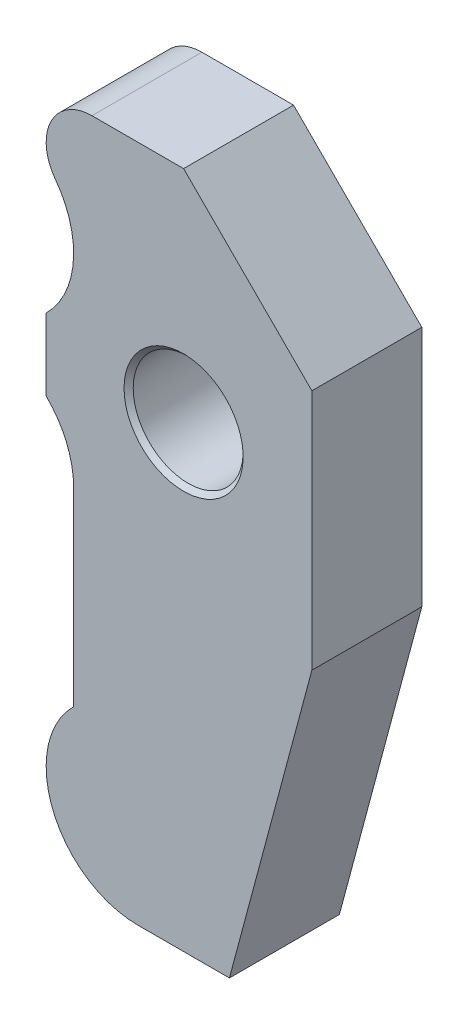
ISO-10303-21;
HEADER;
FILE_DESCRIPTION(('STEP AP214'),'2;1');
FILE_NAME('part.step','',(''),(''),'','','');
FILE_SCHEMA(('AUTOMOTIVE_DESIGN { 1 0 10303 214 1 1 1 1 }'));
ENDSEC;
DATA;
#1=APPLICATION_CONTEXT('core data for automotive mechanical design processes');
#2=APPLICATION_PROTOCOL_DEFINITION('international standard','automotive_design',2000,#1);
#3=PRODUCT_CONTEXT('',#1,'mechanical');
#4=PRODUCT('Part','Part','',(#3));
#5=PRODUCT_RELATED_PRODUCT_CATEGORY('part','',(#4));
#6=PRODUCT_DEFINITION_FORMATION('','',#4);
#7=PRODUCT_DEFINITION_CONTEXT('part definition',#1,'design');
#8=PRODUCT_DEFINITION('design','',#6,#7);
#9=PRODUCT_DEFINITION_SHAPE('','',#8);
#10=(LENGTH_UNIT() NAMED_UNIT(*) SI_UNIT(.MILLI.,.METRE.));
#11=(NAMED_UNIT(*) PLANE_ANGLE_UNIT() SI_UNIT($,.RADIAN.));
#12=(NAMED_UNIT(*) SI_UNIT($,.STERADIAN.) SOLID_ANGLE_UNIT());
#13=UNCERTAINTY_MEASURE_WITH_UNIT(LENGTH_MEASURE(1.E-05),#10,'distance_accuracy_value','');
#14=(GEOMETRIC_REPRESENTATION_CONTEXT(3) GLOBAL_UNCERTAINTY_ASSIGNED_CONTEXT((#13)) GLOBAL_UNIT_ASSIGNED_CONTEXT((#10,
#11,#12)) REPRESENTATION_CONTEXT('',''));
#15=CARTESIAN_POINT('',(0.,0.,0.));
#16=DIRECTION('',(0.,0.,1.));
#17=DIRECTION('',(1.,0.,0.));
#18=AXIS2_PLACEMENT_3D('',#15,#16,#17);
#19=CARTESIAN_POINT('',(-10.,19.,6.));
#20=DIRECTION('',(0.,0.,-1.));
#21=DIRECTION('',(-1.,0.,0.));
#22=AXIS2_PLACEMENT_3D('',#19,#20,#21);
#23=PLANE('',#22);
#24=CARTESIAN_POINT('',(0.,0.,6.));
#25=DIRECTION('',(0.,0.,-1.));
#26=DIRECTION('',(-1.,0.,0.));
#27=AXIS2_PLACEMENT_3D('',#24,#25,#26);
#28=CIRCLE('',#27,6.50000000000001);
#29=CARTESIAN_POINT('',(-6.50000000000001,0.,6.));
#30=VERTEX_POINT('',#29);
#31=EDGE_CURVE('E11',#30,#30,#28,.T.);
#32=ORIENTED_EDGE('',*,*,#31,.T.);
#33=EDGE_LOOP('',(#32));
#34=FACE_BOUND('',#33,.T.);
#35=DIRECTION('',(-1.,0.,0.));
#36=VECTOR('',#35,1.);
#37=CARTESIAN_POINT('',(0.,24.,6.));
#38=LINE('',#37,#36);
#39=CARTESIAN_POINT('',(0.,24.,6.));
#40=VERTEX_POINT('',#39);
#41=CARTESIAN_POINT('',(-10.,24.,6.));
#42=VERTEX_POINT('',#41);
#43=EDGE_CURVE('E171',#40,#42,#38,.T.);
#44=ORIENTED_EDGE('',*,*,#43,.T.);
#45=CARTESIAN_POINT('',(-10.,19.,6.));
#46=DIRECTION('',(0.,0.,1.));
#47=DIRECTION('',(-1.,0.,0.));
#48=AXIS2_PLACEMENT_3D('',#45,#46,#47);
#49=CIRCLE('',#48,5.);
#50=CARTESIAN_POINT('',(-14.,16.,6.));
#51=VERTEX_POINT('',#50);
#52=EDGE_CURVE('E106',#42,#51,#49,.T.);
#53=ORIENTED_EDGE('',*,*,#52,.T.);
#54=CARTESIAN_POINT('',(-22.,10.,6.));
#55=DIRECTION('',(0.,0.,-1.));
#56=DIRECTION('',(1.,0.,0.));
#57=AXIS2_PLACEMENT_3D('',#54,#55,#56);
#58=CIRCLE('',#57,10.);
#59=CARTESIAN_POINT('',(-15.,2.85857157145716,6.));
#60=VERTEX_POINT('',#59);
#61=EDGE_CURVE('E361',#51,#60,#58,.T.);
#62=ORIENTED_EDGE('',*,*,#61,.T.);
#63=DIRECTION('',(0.,-1.,0.));
#64=VECTOR('',#63,1.);
#65=CARTESIAN_POINT('',(-15.,-5.,6.));
#66=LINE('',#65,#64);
#67=CARTESIAN_POINT('',(-15.,-5.,6.));
#68=VERTEX_POINT('',#67);
#69=EDGE_CURVE('E372',#60,#68,#66,.T.);
#70=ORIENTED_EDGE('',*,*,#69,.T.);
#71=CARTESIAN_POINT('',(-22.,-12.1414284285429,6.));
#72=DIRECTION('',(0.,0.,-1.));
#73=DIRECTION('',(1.,0.,0.));
#74=AXIS2_PLACEMENT_3D('',#71,#72,#73);
#75=CIRCLE('',#74,10.);
#76=CARTESIAN_POINT('',(-12.,-12.1414284285429,6.));
#77=VERTEX_POINT('',#76);
#78=EDGE_CURVE('E369',#68,#77,#75,.T.);
#79=ORIENTED_EDGE('',*,*,#78,.T.);
#80=DIRECTION('',(0.,-1.,0.));
#81=VECTOR('',#80,1.);
#82=CARTESIAN_POINT('',(-12.,-32.8585715714571,6.));
#83=LINE('',#82,#81);
#84=CARTESIAN_POINT('',(-12.,-32.8585715714571,6.));
#85=VERTEX_POINT('',#84);
#86=EDGE_CURVE('E371',#77,#85,#83,.T.);
#87=ORIENTED_EDGE('',*,*,#86,.T.);
#88=CARTESIAN_POINT('',(-5.,-40.,6.));
#89=DIRECTION('',(0.,0.,1.));
#90=DIRECTION('',(-1.,0.,0.));
#91=AXIS2_PLACEMENT_3D('',#88,#89,#90);
#92=CIRCLE('',#91,10.);
#93=CARTESIAN_POINT('',(-5.,-50.,6.));
#94=VERTEX_POINT('',#93);
#95=EDGE_CURVE('E374',#85,#94,#92,.T.);
#96=ORIENTED_EDGE('',*,*,#95,.T.);
#97=DIRECTION('',(1.,0.,0.));
#98=VECTOR('',#97,1.);
#99=CARTESIAN_POINT('',(5.00000000000001,-50.,6.));
#100=LINE('',#99,#98);
#101=CARTESIAN_POINT('',(5.00000000000001,-50.,6.));
#102=VERTEX_POINT('',#101);
#103=EDGE_CURVE('E133',#94,#102,#100,.T.);
#104=ORIENTED_EDGE('',*,*,#103,.T.);
#105=DIRECTION('',(0.258819045102514,0.96592582628907,0.));
#106=VECTOR('',#105,1.);
#107=CARTESIAN_POINT('',(14.,-16.4115427318792,6.));
#108=LINE('',#107,#106);
#109=CARTESIAN_POINT('',(14.,-16.4115427318792,6.));
#110=VERTEX_POINT('',#109);
#111=EDGE_CURVE('E128',#102,#110,#108,.T.);
#112=ORIENTED_EDGE('',*,*,#111,.T.);
#113=DIRECTION('',(0.,1.,0.));
#114=VECTOR('',#113,1.);
#115=CARTESIAN_POINT('',(14.,10.0000000000002,6.));
#116=LINE('',#115,#114);
#117=CARTESIAN_POINT('',(14.,10.0000000000002,6.));
#118=VERTEX_POINT('',#117);
#119=EDGE_CURVE('E131',#110,#118,#116,.T.);
#120=ORIENTED_EDGE('',*,*,#119,.T.);
#121=DIRECTION('',(-0.707106781186551,0.707106781186543,0.));
#122=VECTOR('',#121,1.);
#123=CARTESIAN_POINT('',(0.,24.,6.));
#124=LINE('',#123,#122);
#125=EDGE_CURVE('E53',#118,#40,#124,.T.);
#126=ORIENTED_EDGE('',*,*,#125,.T.);
#127=EDGE_LOOP('',(#44,#53,#62,#70,#79,#87,#96,#104,#112,#120,#126));
#128=FACE_BOUND('',#127,.T.);
#129=ADVANCED_FACE('F36',(#34,#128),#23,.F.);
#130=CARTESIAN_POINT('',(-10.,19.,-6.));
#131=DIRECTION('',(0.,0.,-1.));
#132=DIRECTION('',(-1.,0.,0.));
#133=AXIS2_PLACEMENT_3D('',#130,#131,#132);
#134=PLANE('',#133);
#135=CARTESIAN_POINT('',(0.,0.,-6.));
#136=DIRECTION('',(0.,0.,-1.));
#137=DIRECTION('',(-1.,0.,0.));
#138=AXIS2_PLACEMENT_3D('',#135,#136,#137);
#139=CIRCLE('',#138,6.50000000000001);
#140=CARTESIAN_POINT('',(-6.50000000000001,0.,-6.));
#141=VERTEX_POINT('',#140);
#142=EDGE_CURVE('E195',#141,#141,#139,.F.);
#143=ORIENTED_EDGE('',*,*,#142,.T.);
#144=EDGE_LOOP('',(#143));
#145=FACE_BOUND('',#144,.T.);
#146=DIRECTION('',(-1.,0.,0.));
#147=VECTOR('',#146,1.);
#148=CARTESIAN_POINT('',(0.,24.,-6.));
#149=LINE('',#148,#147);
#150=CARTESIAN_POINT('',(0.,24.,-6.));
#151=VERTEX_POINT('',#150);
#152=CARTESIAN_POINT('',(-10.,24.,-6.));
#153=VERTEX_POINT('',#152);
#154=EDGE_CURVE('E151',#151,#153,#149,.T.);
#155=ORIENTED_EDGE('',*,*,#154,.F.);
#156=DIRECTION('',(-0.707106781186551,0.707106781186543,0.));
#157=VECTOR('',#156,1.);
#158=CARTESIAN_POINT('',(0.,24.,-6.));
#159=LINE('',#158,#157);
#160=CARTESIAN_POINT('',(14.,10.0000000000002,-6.));
#161=VERTEX_POINT('',#160);
#162=EDGE_CURVE('E97',#161,#151,#159,.T.);
#163=ORIENTED_EDGE('',*,*,#162,.F.);
#164=DIRECTION('',(0.,1.,0.));
#165=VECTOR('',#164,1.);
#166=CARTESIAN_POINT('',(14.,10.0000000000002,-6.));
#167=LINE('',#166,#165);
#168=CARTESIAN_POINT('',(14.,-16.4115427318792,-6.));
#169=VERTEX_POINT('',#168);
#170=EDGE_CURVE('E91',#169,#161,#167,.T.);
#171=ORIENTED_EDGE('',*,*,#170,.F.);
#172=DIRECTION('',(0.258819045102514,0.96592582628907,0.));
#173=VECTOR('',#172,1.);
#174=CARTESIAN_POINT('',(14.,-16.4115427318792,-6.));
#175=LINE('',#174,#173);
#176=CARTESIAN_POINT('',(5.00000000000001,-50.,-6.));
#177=VERTEX_POINT('',#176);
#178=EDGE_CURVE('E141',#177,#169,#175,.T.);
#179=ORIENTED_EDGE('',*,*,#178,.F.);
#180=DIRECTION('',(1.,0.,0.));
#181=VECTOR('',#180,1.);
#182=CARTESIAN_POINT('',(5.00000000000001,-50.,-6.));
#183=LINE('',#182,#181);
#184=CARTESIAN_POINT('',(-5.,-50.,-6.));
#185=VERTEX_POINT('',#184);
#186=EDGE_CURVE('E166',#185,#177,#183,.T.);
#187=ORIENTED_EDGE('',*,*,#186,.F.);
#188=CARTESIAN_POINT('',(-5.,-40.,-6.));
#189=DIRECTION('',(0.,0.,1.));
#190=DIRECTION('',(-1.,0.,0.));
#191=AXIS2_PLACEMENT_3D('',#188,#189,#190);
#192=CIRCLE('',#191,10.);
#193=CARTESIAN_POINT('',(-12.,-32.8585715714571,-6.));
#194=VERTEX_POINT('',#193);
#195=EDGE_CURVE('E164',#194,#185,#192,.T.);
#196=ORIENTED_EDGE('',*,*,#195,.F.);
#197=DIRECTION('',(0.,-1.,0.));
#198=VECTOR('',#197,1.);
#199=CARTESIAN_POINT('',(-12.,-32.8585715714571,-6.));
#200=LINE('',#199,#198);
#201=CARTESIAN_POINT('',(-12.,-12.1414284285429,-6.));
#202=VERTEX_POINT('',#201);
#203=EDGE_CURVE('E162',#202,#194,#200,.T.);
#204=ORIENTED_EDGE('',*,*,#203,.F.);
#205=CARTESIAN_POINT('',(-22.,-12.1414284285429,-6.));
#206=DIRECTION('',(0.,0.,-1.));
#207=DIRECTION('',(1.,0.,0.));
#208=AXIS2_PLACEMENT_3D('',#205,#206,#207);
#209=CIRCLE('',#208,10.);
#210=CARTESIAN_POINT('',(-15.,-5.,-6.));
#211=VERTEX_POINT('',#210);
#212=EDGE_CURVE('E160',#211,#202,#209,.T.);
#213=ORIENTED_EDGE('',*,*,#212,.F.);
#214=DIRECTION('',(0.,-1.,0.));
#215=VECTOR('',#214,1.);
#216=CARTESIAN_POINT('',(-15.,-5.,-6.));
#217=LINE('',#216,#215);
#218=CARTESIAN_POINT('',(-15.,2.85857157145716,-6.));
#219=VERTEX_POINT('',#218);
#220=EDGE_CURVE('E158',#219,#211,#217,.T.);
#221=ORIENTED_EDGE('',*,*,#220,.F.);
#222=CARTESIAN_POINT('',(-22.,10.,-6.));
#223=DIRECTION('',(0.,0.,-1.));
#224=DIRECTION('',(1.,0.,0.));
#225=AXIS2_PLACEMENT_3D('',#222,#223,#224);
#226=CIRCLE('',#225,10.);
#227=CARTESIAN_POINT('',(-14.,16.,-6.));
#228=VERTEX_POINT('',#227);
#229=EDGE_CURVE('E156',#228,#219,#226,.T.);
#230=ORIENTED_EDGE('',*,*,#229,.F.);
#231=CARTESIAN_POINT('',(-10.,19.,-6.));
#232=DIRECTION('',(0.,0.,1.));
#233=DIRECTION('',(-1.,0.,0.));
#234=AXIS2_PLACEMENT_3D('',#231,#232,#233);
#235=CIRCLE('',#234,5.);
#236=EDGE_CURVE('E154',#153,#228,#235,.T.);
#237=ORIENTED_EDGE('',*,*,#236,.F.);
#238=EDGE_LOOP('',(#155,#163,#171,#179,#187,#196,#204,#213,#221,#230,#237));
#239=FACE_BOUND('',#238,.T.);
#240=ADVANCED_FACE('F211',(#145,#239),#134,.T.);
#241=CARTESIAN_POINT('',(0.,24.,6.));
#242=DIRECTION('',(0.,-1.,0.));
#243=DIRECTION('',(0.,0.,-1.));
#244=AXIS2_PLACEMENT_3D('',#241,#242,#243);
#245=PLANE('',#244);
#246=ORIENTED_EDGE('',*,*,#154,.T.);
#247=DIRECTION('',(0.,0.,-1.));
#248=VECTOR('',#247,1.);
#249=CARTESIAN_POINT('',(-10.,24.,6.));
#250=LINE('',#249,#248);
#251=EDGE_CURVE('E193',#42,#153,#250,.T.);
#252=ORIENTED_EDGE('',*,*,#251,.F.);
#253=ORIENTED_EDGE('',*,*,#43,.F.);
#254=DIRECTION('',(0.,0.,-1.));
#255=VECTOR('',#254,1.);
#256=CARTESIAN_POINT('',(0.,24.,6.));
#257=LINE('',#256,#255);
#258=EDGE_CURVE('E147',#40,#151,#257,.T.);
#259=ORIENTED_EDGE('',*,*,#258,.T.);
#260=EDGE_LOOP('',(#246,#252,#253,#259));
#261=FACE_BOUND('',#260,.T.);
#262=ADVANCED_FACE('F214',(#261),#245,.F.);
#263=CARTESIAN_POINT('',(-10.,19.,6.));
#264=DIRECTION('',(0.,0.,-1.));
#265=DIRECTION('',(-1.,0.,0.));
#266=AXIS2_PLACEMENT_3D('',#263,#264,#265);
#267=CYLINDRICAL_SURFACE('',#266,5.);
#268=ORIENTED_EDGE('',*,*,#236,.T.);
#269=DIRECTION('',(0.,0.,-1.));
#270=VECTOR('',#269,1.);
#271=CARTESIAN_POINT('',(-14.,16.,6.));
#272=LINE('',#271,#270);
#273=EDGE_CURVE('E190',#51,#228,#272,.T.);
#274=ORIENTED_EDGE('',*,*,#273,.F.);
#275=ORIENTED_EDGE('',*,*,#52,.F.);
#276=ORIENTED_EDGE('',*,*,#251,.T.);
#277=EDGE_LOOP('',(#268,#274,#275,#276));
#278=FACE_BOUND('',#277,.T.);
#279=ADVANCED_FACE('F340',(#278),#267,.T.);
#280=CARTESIAN_POINT('',(-22.,10.,6.));
#281=DIRECTION('',(0.,0.,-1.));
#282=DIRECTION('',(-1.,0.,0.));
#283=AXIS2_PLACEMENT_3D('',#280,#281,#282);
#284=CYLINDRICAL_SURFACE('',#283,10.);
#285=ORIENTED_EDGE('',*,*,#229,.T.);
#286=DIRECTION('',(0.,0.,-1.));
#287=VECTOR('',#286,1.);
#288=CARTESIAN_POINT('',(-15.,2.85857157145716,6.));
#289=LINE('',#288,#287);
#290=EDGE_CURVE('E187',#60,#219,#289,.T.);
#291=ORIENTED_EDGE('',*,*,#290,.F.);
#292=ORIENTED_EDGE('',*,*,#61,.F.);
#293=ORIENTED_EDGE('',*,*,#273,.T.);
#294=EDGE_LOOP('',(#285,#291,#292,#293));
#295=FACE_BOUND('',#294,.T.);
#296=ADVANCED_FACE('F330',(#295),#284,.F.);
#297=CARTESIAN_POINT('',(-15.,-5.,6.));
#298=DIRECTION('',(1.,0.,0.));
#299=DIRECTION('',(0.,0.,-1.));
#300=AXIS2_PLACEMENT_3D('',#297,#298,#299);
#301=PLANE('',#300);
#302=ORIENTED_EDGE('',*,*,#220,.T.);
#303=DIRECTION('',(0.,0.,-1.));
#304=VECTOR('',#303,1.);
#305=CARTESIAN_POINT('',(-15.,-5.,6.));
#306=LINE('',#305,#304);
#307=EDGE_CURVE('E184',#68,#211,#306,.T.);
#308=ORIENTED_EDGE('',*,*,#307,.F.);
#309=ORIENTED_EDGE('',*,*,#69,.F.);
#310=ORIENTED_EDGE('',*,*,#290,.T.);
#311=EDGE_LOOP('',(#302,#308,#309,#310));
#312=FACE_BOUND('',#311,.T.);
#313=ADVANCED_FACE('F320',(#312),#301,.F.);
#314=CARTESIAN_POINT('',(-22.,-12.1414284285429,6.));
#315=DIRECTION('',(0.,0.,-1.));
#316=DIRECTION('',(-1.,0.,0.));
#317=AXIS2_PLACEMENT_3D('',#314,#315,#316);
#318=CYLINDRICAL_SURFACE('',#317,10.);
#319=ORIENTED_EDGE('',*,*,#212,.T.);
#320=DIRECTION('',(0.,0.,-1.));
#321=VECTOR('',#320,1.);
#322=CARTESIAN_POINT('',(-12.,-12.1414284285429,6.));
#323=LINE('',#322,#321);
#324=EDGE_CURVE('E181',#77,#202,#323,.T.);
#325=ORIENTED_EDGE('',*,*,#324,.F.);
#326=ORIENTED_EDGE('',*,*,#78,.F.);
#327=ORIENTED_EDGE('',*,*,#307,.T.);
#328=EDGE_LOOP('',(#319,#325,#326,#327));
#329=FACE_BOUND('',#328,.T.);
#330=ADVANCED_FACE('F310',(#329),#318,.F.);
#331=CARTESIAN_POINT('',(-12.,-32.8585715714571,6.));
#332=DIRECTION('',(1.,0.,0.));
#333=DIRECTION('',(0.,1.,0.));
#334=AXIS2_PLACEMENT_3D('',#331,#332,#333);
#335=PLANE('',#334);
#336=ORIENTED_EDGE('',*,*,#203,.T.);
#337=DIRECTION('',(0.,0.,-1.));
#338=VECTOR('',#337,1.);
#339=CARTESIAN_POINT('',(-12.,-32.8585715714571,6.));
#340=LINE('',#339,#338);
#341=EDGE_CURVE('E178',#85,#194,#340,.T.);
#342=ORIENTED_EDGE('',*,*,#341,.F.);
#343=ORIENTED_EDGE('',*,*,#86,.F.);
#344=ORIENTED_EDGE('',*,*,#324,.T.);
#345=EDGE_LOOP('',(#336,#342,#343,#344));
#346=FACE_BOUND('',#345,.T.);
#347=ADVANCED_FACE('F300',(#346),#335,.F.);
#348=CARTESIAN_POINT('',(-5.,-40.,6.));
#349=DIRECTION('',(0.,0.,-1.));
#350=DIRECTION('',(-1.,0.,0.));
#351=AXIS2_PLACEMENT_3D('',#348,#349,#350);
#352=CYLINDRICAL_SURFACE('',#351,10.);
#353=ORIENTED_EDGE('',*,*,#195,.T.);
#354=DIRECTION('',(0.,0.,-1.));
#355=VECTOR('',#354,1.);
#356=CARTESIAN_POINT('',(-5.,-50.,6.));
#357=LINE('',#356,#355);
#358=EDGE_CURVE('E175',#94,#185,#357,.T.);
#359=ORIENTED_EDGE('',*,*,#358,.F.);
#360=ORIENTED_EDGE('',*,*,#95,.F.);
#361=ORIENTED_EDGE('',*,*,#341,.T.);
#362=EDGE_LOOP('',(#353,#359,#360,#361));
#363=FACE_BOUND('',#362,.T.);
#364=ADVANCED_FACE('F290',(#363),#352,.T.);
#365=CARTESIAN_POINT('',(5.00000000000001,-50.,6.));
#366=DIRECTION('',(0.,1.,0.));
#367=DIRECTION('',(0.,0.,1.));
#368=AXIS2_PLACEMENT_3D('',#365,#366,#367);
#369=PLANE('',#368);
#370=ORIENTED_EDGE('',*,*,#186,.T.);
#371=DIRECTION('',(0.,0.,-1.));
#372=VECTOR('',#371,1.);
#373=CARTESIAN_POINT('',(5.00000000000001,-50.,6.));
#374=LINE('',#373,#372);
#375=EDGE_CURVE('E142',#102,#177,#374,.T.);
#376=ORIENTED_EDGE('',*,*,#375,.F.);
#377=ORIENTED_EDGE('',*,*,#103,.F.);
#378=ORIENTED_EDGE('',*,*,#358,.T.);
#379=EDGE_LOOP('',(#370,#376,#377,#378));
#380=FACE_BOUND('',#379,.T.);
#381=ADVANCED_FACE('F281',(#380),#369,.F.);
#382=CARTESIAN_POINT('',(14.,-16.4115427318792,6.));
#383=DIRECTION('',(-0.96592582628907,0.258819045102514,0.));
#384=DIRECTION('',(-0.258819045102514,-0.96592582628907,0.));
#385=AXIS2_PLACEMENT_3D('',#382,#383,#384);
#386=PLANE('',#385);
#387=ORIENTED_EDGE('',*,*,#178,.T.);
#388=DIRECTION('',(0.,0.,-1.));
#389=VECTOR('',#388,1.);
#390=CARTESIAN_POINT('',(14.,-16.4115427318792,6.));
#391=LINE('',#390,#389);
#392=EDGE_CURVE('E138',#110,#169,#391,.T.);
#393=ORIENTED_EDGE('',*,*,#392,.F.);
#394=ORIENTED_EDGE('',*,*,#111,.F.);
#395=ORIENTED_EDGE('',*,*,#375,.T.);
#396=EDGE_LOOP('',(#387,#393,#394,#395));
#397=FACE_BOUND('',#396,.T.);
#398=ADVANCED_FACE('F139',(#397),#386,.F.);
#399=CARTESIAN_POINT('',(14.,10.0000000000002,6.));
#400=DIRECTION('',(-1.,0.,0.));
#401=DIRECTION('',(0.,-1.,0.));
#402=AXIS2_PLACEMENT_3D('',#399,#400,#401);
#403=PLANE('',#402);
#404=ORIENTED_EDGE('',*,*,#170,.T.);
#405=DIRECTION('',(0.,0.,-1.));
#406=VECTOR('',#405,1.);
#407=CARTESIAN_POINT('',(14.,10.0000000000002,6.));
#408=LINE('',#407,#406);
#409=EDGE_CURVE('E143',#118,#161,#408,.T.);
#410=ORIENTED_EDGE('',*,*,#409,.F.);
#411=ORIENTED_EDGE('',*,*,#119,.F.);
#412=ORIENTED_EDGE('',*,*,#392,.T.);
#413=EDGE_LOOP('',(#404,#410,#411,#412));
#414=FACE_BOUND('',#413,.T.);
#415=ADVANCED_FACE('F145',(#414),#403,.F.);
#416=CARTESIAN_POINT('',(0.,24.,6.));
#417=DIRECTION('',(-0.707106781186543,-0.707106781186552,0.));
#418=DIRECTION('',(0.707106781186552,-0.707106781186543,0.));
#419=AXIS2_PLACEMENT_3D('',#416,#417,#418);
#420=PLANE('',#419);
#421=ORIENTED_EDGE('',*,*,#162,.T.);
#422=ORIENTED_EDGE('',*,*,#258,.F.);
#423=ORIENTED_EDGE('',*,*,#125,.F.);
#424=ORIENTED_EDGE('',*,*,#409,.T.);
#425=EDGE_LOOP('',(#421,#422,#423,#424));
#426=FACE_BOUND('',#425,.T.);
#427=ADVANCED_FACE('F221',(#426),#420,.F.);
#428=CARTESIAN_POINT('',(0.,0.,6.));
#429=DIRECTION('',(0.,0.,-1.));
#430=DIRECTION('',(-1.,0.,0.));
#431=AXIS2_PLACEMENT_3D('',#428,#429,#430);
#432=CYLINDRICAL_SURFACE('',#431,6.);
#433=CARTESIAN_POINT('',(0.,0.,-5.5));
#434=DIRECTION('',(0.,0.,-1.));
#435=DIRECTION('',(-1.,0.,0.));
#436=AXIS2_PLACEMENT_3D('',#433,#434,#435);
#437=CIRCLE('',#436,6.);
#438=CARTESIAN_POINT('',(-6.,0.,-5.5));
#439=VERTEX_POINT('',#438);
#440=EDGE_CURVE('E45',#439,#439,#437,.T.);
#441=ORIENTED_EDGE('',*,*,#440,.T.);
#442=EDGE_LOOP('',(#441));
#443=FACE_BOUND('',#442,.T.);
#444=CARTESIAN_POINT('',(0.,0.,5.49999999999999));
#445=DIRECTION('',(0.,0.,-1.));
#446=DIRECTION('',(-1.,0.,0.));
#447=AXIS2_PLACEMENT_3D('',#444,#445,#446);
#448=CIRCLE('',#447,6.);
#449=CARTESIAN_POINT('',(-6.,0.,5.49999999999999));
#450=VERTEX_POINT('',#449);
#451=EDGE_CURVE('E198',#450,#450,#448,.F.);
#452=ORIENTED_EDGE('',*,*,#451,.T.);
#453=EDGE_LOOP('',(#452));
#454=FACE_BOUND('',#453,.T.);
#455=ADVANCED_FACE('F203',(#443,#454),#432,.F.);
#456=CARTESIAN_POINT('',(0.,0.,-6.));
#457=DIRECTION('',(0.,0.,-1.));
#458=DIRECTION('',(-1.,0.,0.));
#459=AXIS2_PLACEMENT_3D('',#456,#457,#458);
#460=CONICAL_SURFACE('',#459,6.50000000000001,0.785398163397449);
#461=ORIENTED_EDGE('',*,*,#440,.F.);
#462=EDGE_LOOP('',(#461));
#463=FACE_BOUND('',#462,.T.);
#464=ORIENTED_EDGE('',*,*,#142,.F.);
#465=EDGE_LOOP('',(#464));
#466=FACE_BOUND('',#465,.T.);
#467=ADVANCED_FACE('F206',(#463,#466),#460,.F.);
#468=CARTESIAN_POINT('',(0.,0.,5.49999999999999));
#469=DIRECTION('',(0.,0.,1.));
#470=DIRECTION('',(1.,0.,0.));
#471=AXIS2_PLACEMENT_3D('',#468,#469,#470);
#472=CONICAL_SURFACE('',#471,6.,0.785398163397448);
#473=ORIENTED_EDGE('',*,*,#31,.F.);
#474=EDGE_LOOP('',(#473));
#475=FACE_BOUND('',#474,.T.);
#476=ORIENTED_EDGE('',*,*,#451,.F.);
#477=EDGE_LOOP('',(#476));
#478=FACE_BOUND('',#477,.T.);
#479=ADVANCED_FACE('F38',(#475,#478),#472,.F.);
#480=CLOSED_SHELL('',(#129,#240,#262,#279,#296,#313,#330,#347,#364,#381,#398,#415,#427,#455,
#467,#479));
#481=MANIFOLD_SOLID_BREP('B2',#480);
#482=ADVANCED_BREP_SHAPE_REPRESENTATION('',(#18,#481),#14);
#483=SHAPE_DEFINITION_REPRESENTATION(#9,#482);
ENDSEC;
END-ISO-10303-21;
